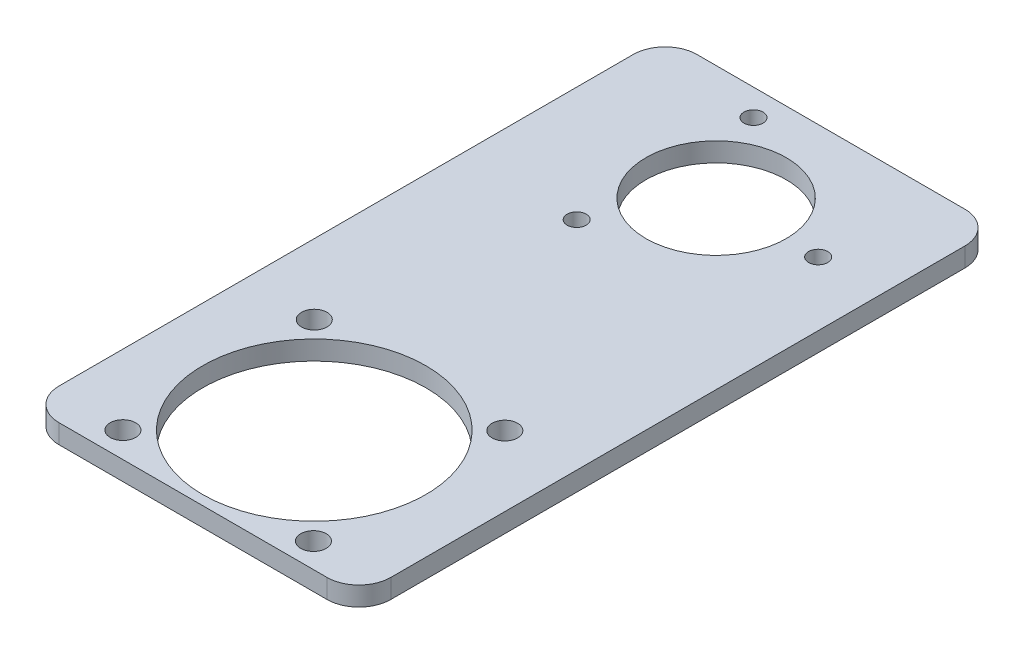
ISO-10303-21;
HEADER;
FILE_DESCRIPTION(('STEP AP214'),'2;1');
FILE_NAME('part.step','',(''),(''),'','','');
FILE_SCHEMA(('AUTOMOTIVE_DESIGN { 1 0 10303 214 1 1 1 1 }'));
ENDSEC;
DATA;
#1=APPLICATION_CONTEXT('core data for automotive mechanical design processes');
#2=APPLICATION_PROTOCOL_DEFINITION('international standard','automotive_design',2000,#1);
#3=PRODUCT_CONTEXT('',#1,'mechanical');
#4=PRODUCT('Part','Part','',(#3));
#5=PRODUCT_RELATED_PRODUCT_CATEGORY('part','',(#4));
#6=PRODUCT_DEFINITION_FORMATION('','',#4);
#7=PRODUCT_DEFINITION_CONTEXT('part definition',#1,'design');
#8=PRODUCT_DEFINITION('design','',#6,#7);
#9=PRODUCT_DEFINITION_SHAPE('','',#8);
#10=(LENGTH_UNIT() NAMED_UNIT(*) SI_UNIT(.MILLI.,.METRE.));
#11=(NAMED_UNIT(*) PLANE_ANGLE_UNIT() SI_UNIT($,.RADIAN.));
#12=(NAMED_UNIT(*) SI_UNIT($,.STERADIAN.) SOLID_ANGLE_UNIT());
#13=UNCERTAINTY_MEASURE_WITH_UNIT(LENGTH_MEASURE(1.E-05),#10,'distance_accuracy_value','');
#14=(GEOMETRIC_REPRESENTATION_CONTEXT(3) GLOBAL_UNCERTAINTY_ASSIGNED_CONTEXT((#13)) GLOBAL_UNIT_ASSIGNED_CONTEXT((#10,
#11,#12)) REPRESENTATION_CONTEXT('',''));
#15=CARTESIAN_POINT('',(0.,0.,0.));
#16=DIRECTION('',(0.,0.,1.));
#17=DIRECTION('',(1.,0.,0.));
#18=AXIS2_PLACEMENT_3D('',#15,#16,#17);
#19=CARTESIAN_POINT('',(0.,3.,-50.));
#20=DIRECTION('',(0.,0.,-1.));
#21=DIRECTION('',(-1.,0.,0.));
#22=AXIS2_PLACEMENT_3D('',#19,#20,#21);
#23=PLANE('',#22);
#24=DIRECTION('',(1.,0.,0.));
#25=VECTOR('',#24,1.);
#26=CARTESIAN_POINT('',(0.,0.,-50.));
#27=LINE('',#26,#25);
#28=CARTESIAN_POINT('',(-21.,0.,-50.));
#29=VERTEX_POINT('',#28);
#30=CARTESIAN_POINT('',(21.,0.,-50.));
#31=VERTEX_POINT('',#30);
#32=EDGE_CURVE('E150',#29,#31,#27,.T.);
#33=ORIENTED_EDGE('',*,*,#32,.F.);
#34=DIRECTION('',(0.,-1.,0.));
#35=VECTOR('',#34,1.);
#36=CARTESIAN_POINT('',(-21.,3.,-50.));
#37=LINE('',#36,#35);
#38=CARTESIAN_POINT('',(-21.,3.,-50.));
#39=VERTEX_POINT('',#38);
#40=EDGE_CURVE('E11',#39,#29,#37,.T.);
#41=ORIENTED_EDGE('',*,*,#40,.F.);
#42=DIRECTION('',(1.,0.,0.));
#43=VECTOR('',#42,1.);
#44=CARTESIAN_POINT('',(0.,3.,-50.));
#45=LINE('',#44,#43);
#46=CARTESIAN_POINT('',(21.,3.,-50.));
#47=VERTEX_POINT('',#46);
#48=EDGE_CURVE('E402',#39,#47,#45,.T.);
#49=ORIENTED_EDGE('',*,*,#48,.T.);
#50=DIRECTION('',(0.,-1.,0.));
#51=VECTOR('',#50,1.);
#52=CARTESIAN_POINT('',(21.,3.,-50.));
#53=LINE('',#52,#51);
#54=EDGE_CURVE('E85',#47,#31,#53,.T.);
#55=ORIENTED_EDGE('',*,*,#54,.T.);
#56=EDGE_LOOP('',(#33,#41,#49,#55));
#57=FACE_BOUND('',#56,.T.);
#58=ADVANCED_FACE('F34',(#57),#23,.T.);
#59=CARTESIAN_POINT('',(-21.,3.,-45.));
#60=DIRECTION('',(0.,-1.,0.));
#61=DIRECTION('',(0.,0.,-1.));
#62=AXIS2_PLACEMENT_3D('',#59,#60,#61);
#63=CYLINDRICAL_SURFACE('',#62,5.);
#64=CARTESIAN_POINT('',(-21.,0.,-45.));
#65=DIRECTION('',(0.,1.,0.));
#66=DIRECTION('',(0.,0.,1.));
#67=AXIS2_PLACEMENT_3D('',#64,#65,#66);
#68=CIRCLE('',#67,5.);
#69=CARTESIAN_POINT('',(-26.,0.,-45.));
#70=VERTEX_POINT('',#69);
#71=EDGE_CURVE('E148',#29,#70,#68,.T.);
#72=ORIENTED_EDGE('',*,*,#71,.T.);
#73=DIRECTION('',(0.,-1.,0.));
#74=VECTOR('',#73,1.);
#75=CARTESIAN_POINT('',(-26.,3.,-45.));
#76=LINE('',#75,#74);
#77=CARTESIAN_POINT('',(-26.,3.,-45.));
#78=VERTEX_POINT('',#77);
#79=EDGE_CURVE('E43',#78,#70,#76,.T.);
#80=ORIENTED_EDGE('',*,*,#79,.F.);
#81=CARTESIAN_POINT('',(-21.,3.,-45.));
#82=DIRECTION('',(0.,1.,0.));
#83=DIRECTION('',(0.,0.,1.));
#84=AXIS2_PLACEMENT_3D('',#81,#82,#83);
#85=CIRCLE('',#84,5.);
#86=EDGE_CURVE('E399',#39,#78,#85,.T.);
#87=ORIENTED_EDGE('',*,*,#86,.F.);
#88=ORIENTED_EDGE('',*,*,#40,.T.);
#89=EDGE_LOOP('',(#72,#80,#87,#88));
#90=FACE_BOUND('',#89,.T.);
#91=ADVANCED_FACE('F149',(#90),#63,.T.);
#92=CARTESIAN_POINT('',(-26.,3.,0.));
#93=DIRECTION('',(-1.,0.,0.));
#94=DIRECTION('',(0.,0.,1.));
#95=AXIS2_PLACEMENT_3D('',#92,#93,#94);
#96=PLANE('',#95);
#97=DIRECTION('',(0.,0.,-1.));
#98=VECTOR('',#97,1.);
#99=CARTESIAN_POINT('',(-26.,0.,0.));
#100=LINE('',#99,#98);
#101=CARTESIAN_POINT('',(-26.,0.,45.));
#102=VERTEX_POINT('',#101);
#103=EDGE_CURVE('E142',#102,#70,#100,.T.);
#104=ORIENTED_EDGE('',*,*,#103,.F.);
#105=DIRECTION('',(0.,-1.,0.));
#106=VECTOR('',#105,1.);
#107=CARTESIAN_POINT('',(-26.,3.,45.));
#108=LINE('',#107,#106);
#109=CARTESIAN_POINT('',(-26.,3.,45.));
#110=VERTEX_POINT('',#109);
#111=EDGE_CURVE('E134',#110,#102,#108,.T.);
#112=ORIENTED_EDGE('',*,*,#111,.F.);
#113=DIRECTION('',(0.,0.,-1.));
#114=VECTOR('',#113,1.);
#115=CARTESIAN_POINT('',(-26.,3.,0.));
#116=LINE('',#115,#114);
#117=EDGE_CURVE('E145',#110,#78,#116,.T.);
#118=ORIENTED_EDGE('',*,*,#117,.T.);
#119=ORIENTED_EDGE('',*,*,#79,.T.);
#120=EDGE_LOOP('',(#104,#112,#118,#119));
#121=FACE_BOUND('',#120,.T.);
#122=ADVANCED_FACE('F140',(#121),#96,.T.);
#123=CARTESIAN_POINT('',(-21.,3.,45.));
#124=DIRECTION('',(0.,-1.,0.));
#125=DIRECTION('',(0.,0.,-1.));
#126=AXIS2_PLACEMENT_3D('',#123,#124,#125);
#127=CYLINDRICAL_SURFACE('',#126,5.);
#128=CARTESIAN_POINT('',(-21.,0.,45.));
#129=DIRECTION('',(0.,1.,0.));
#130=DIRECTION('',(0.,0.,1.));
#131=AXIS2_PLACEMENT_3D('',#128,#129,#130);
#132=CIRCLE('',#131,5.);
#133=CARTESIAN_POINT('',(-21.,0.,50.));
#134=VERTEX_POINT('',#133);
#135=EDGE_CURVE('E155',#134,#102,#132,.F.);
#136=ORIENTED_EDGE('',*,*,#135,.F.);
#137=DIRECTION('',(0.,-1.,0.));
#138=VECTOR('',#137,1.);
#139=CARTESIAN_POINT('',(-21.,3.,50.));
#140=LINE('',#139,#138);
#141=CARTESIAN_POINT('',(-21.,3.,50.));
#142=VERTEX_POINT('',#141);
#143=EDGE_CURVE('E128',#142,#134,#140,.T.);
#144=ORIENTED_EDGE('',*,*,#143,.F.);
#145=CARTESIAN_POINT('',(-21.,3.,45.));
#146=DIRECTION('',(0.,1.,0.));
#147=DIRECTION('',(0.,0.,1.));
#148=AXIS2_PLACEMENT_3D('',#145,#146,#147);
#149=CIRCLE('',#148,5.);
#150=EDGE_CURVE('E398',#142,#110,#149,.F.);
#151=ORIENTED_EDGE('',*,*,#150,.T.);
#152=ORIENTED_EDGE('',*,*,#111,.T.);
#153=EDGE_LOOP('',(#136,#144,#151,#152));
#154=FACE_BOUND('',#153,.T.);
#155=ADVANCED_FACE('F284',(#154),#127,.T.);
#156=CARTESIAN_POINT('',(0.,3.,50.));
#157=DIRECTION('',(0.,0.,-1.));
#158=DIRECTION('',(-1.,0.,0.));
#159=AXIS2_PLACEMENT_3D('',#156,#157,#158);
#160=PLANE('',#159);
#161=DIRECTION('',(1.,0.,0.));
#162=VECTOR('',#161,1.);
#163=CARTESIAN_POINT('',(0.,0.,50.));
#164=LINE('',#163,#162);
#165=CARTESIAN_POINT('',(21.,0.,50.));
#166=VERTEX_POINT('',#165);
#167=EDGE_CURVE('E157',#134,#166,#164,.T.);
#168=ORIENTED_EDGE('',*,*,#167,.T.);
#169=DIRECTION('',(0.,-1.,0.));
#170=VECTOR('',#169,1.);
#171=CARTESIAN_POINT('',(21.,3.,50.));
#172=LINE('',#171,#170);
#173=CARTESIAN_POINT('',(21.,3.,50.));
#174=VERTEX_POINT('',#173);
#175=EDGE_CURVE('E126',#174,#166,#172,.T.);
#176=ORIENTED_EDGE('',*,*,#175,.F.);
#177=DIRECTION('',(1.,0.,0.));
#178=VECTOR('',#177,1.);
#179=CARTESIAN_POINT('',(0.,3.,50.));
#180=LINE('',#179,#178);
#181=EDGE_CURVE('E119',#142,#174,#180,.T.);
#182=ORIENTED_EDGE('',*,*,#181,.F.);
#183=ORIENTED_EDGE('',*,*,#143,.T.);
#184=EDGE_LOOP('',(#168,#176,#182,#183));
#185=FACE_BOUND('',#184,.T.);
#186=ADVANCED_FACE('F281',(#185),#160,.F.);
#187=CARTESIAN_POINT('',(21.,3.,45.));
#188=DIRECTION('',(0.,-1.,0.));
#189=DIRECTION('',(0.,0.,-1.));
#190=AXIS2_PLACEMENT_3D('',#187,#188,#189);
#191=CYLINDRICAL_SURFACE('',#190,5.);
#192=CARTESIAN_POINT('',(21.,0.,45.));
#193=DIRECTION('',(0.,1.,0.));
#194=DIRECTION('',(0.,0.,1.));
#195=AXIS2_PLACEMENT_3D('',#192,#193,#194);
#196=CIRCLE('',#195,5.);
#197=CARTESIAN_POINT('',(26.,0.,45.));
#198=VERTEX_POINT('',#197);
#199=EDGE_CURVE('E125',#166,#198,#196,.T.);
#200=ORIENTED_EDGE('',*,*,#199,.T.);
#201=DIRECTION('',(0.,-1.,0.));
#202=VECTOR('',#201,1.);
#203=CARTESIAN_POINT('',(26.,3.,45.));
#204=LINE('',#203,#202);
#205=CARTESIAN_POINT('',(26.,3.,45.));
#206=VERTEX_POINT('',#205);
#207=EDGE_CURVE('E110',#206,#198,#204,.T.);
#208=ORIENTED_EDGE('',*,*,#207,.F.);
#209=CARTESIAN_POINT('',(21.,3.,45.));
#210=DIRECTION('',(0.,1.,0.));
#211=DIRECTION('',(0.,0.,1.));
#212=AXIS2_PLACEMENT_3D('',#209,#210,#211);
#213=CIRCLE('',#212,5.);
#214=EDGE_CURVE('E113',#174,#206,#213,.T.);
#215=ORIENTED_EDGE('',*,*,#214,.F.);
#216=ORIENTED_EDGE('',*,*,#175,.T.);
#217=EDGE_LOOP('',(#200,#208,#215,#216));
#218=FACE_BOUND('',#217,.T.);
#219=ADVANCED_FACE('F124',(#218),#191,.T.);
#220=CARTESIAN_POINT('',(26.,3.,0.));
#221=DIRECTION('',(-1.,0.,0.));
#222=DIRECTION('',(0.,0.,1.));
#223=AXIS2_PLACEMENT_3D('',#220,#221,#222);
#224=PLANE('',#223);
#225=DIRECTION('',(0.,0.,-1.));
#226=VECTOR('',#225,1.);
#227=CARTESIAN_POINT('',(26.,0.,0.));
#228=LINE('',#227,#226);
#229=CARTESIAN_POINT('',(26.,0.,-45.));
#230=VERTEX_POINT('',#229);
#231=EDGE_CURVE('E164',#198,#230,#228,.T.);
#232=ORIENTED_EDGE('',*,*,#231,.T.);
#233=DIRECTION('',(0.,-1.,0.));
#234=VECTOR('',#233,1.);
#235=CARTESIAN_POINT('',(26.,3.,-45.));
#236=LINE('',#235,#234);
#237=CARTESIAN_POINT('',(26.,3.,-45.));
#238=VERTEX_POINT('',#237);
#239=EDGE_CURVE('E112',#238,#230,#236,.T.);
#240=ORIENTED_EDGE('',*,*,#239,.F.);
#241=DIRECTION('',(0.,0.,-1.));
#242=VECTOR('',#241,1.);
#243=CARTESIAN_POINT('',(26.,3.,0.));
#244=LINE('',#243,#242);
#245=EDGE_CURVE('E105',#206,#238,#244,.T.);
#246=ORIENTED_EDGE('',*,*,#245,.F.);
#247=ORIENTED_EDGE('',*,*,#207,.T.);
#248=EDGE_LOOP('',(#232,#240,#246,#247));
#249=FACE_BOUND('',#248,.T.);
#250=ADVANCED_FACE('F108',(#249),#224,.F.);
#251=CARTESIAN_POINT('',(-15.,3.,46.));
#252=DIRECTION('',(0.,-1.,0.));
#253=DIRECTION('',(0.,0.,-1.));
#254=AXIS2_PLACEMENT_3D('',#251,#252,#253);
#255=CYLINDRICAL_SURFACE('',#254,2.);
#256=CARTESIAN_POINT('',(-15.,3.,46.));
#257=DIRECTION('',(0.,1.,0.));
#258=DIRECTION('',(0.,0.,1.));
#259=AXIS2_PLACEMENT_3D('',#256,#257,#258);
#260=CIRCLE('',#259,2.);
#261=CARTESIAN_POINT('',(-15.,3.,48.));
#262=VERTEX_POINT('',#261);
#263=EDGE_CURVE('E407',#262,#262,#260,.T.);
#264=ORIENTED_EDGE('',*,*,#263,.T.);
#265=EDGE_LOOP('',(#264));
#266=FACE_BOUND('',#265,.T.);
#267=CARTESIAN_POINT('',(-15.,0.,46.));
#268=DIRECTION('',(0.,1.,0.));
#269=DIRECTION('',(0.,0.,1.));
#270=AXIS2_PLACEMENT_3D('',#267,#268,#269);
#271=CIRCLE('',#270,2.);
#272=CARTESIAN_POINT('',(-15.,0.,48.));
#273=VERTEX_POINT('',#272);
#274=EDGE_CURVE('E193',#273,#273,#271,.T.);
#275=ORIENTED_EDGE('',*,*,#274,.F.);
#276=EDGE_LOOP('',(#275));
#277=FACE_BOUND('',#276,.T.);
#278=ADVANCED_FACE('F203',(#266,#277),#255,.F.);
#279=CARTESIAN_POINT('',(14.9997387274878,3.,46.1252049618425));
#280=DIRECTION('',(0.,-1.,0.));
#281=DIRECTION('',(0.,0.,-1.));
#282=AXIS2_PLACEMENT_3D('',#279,#280,#281);
#283=CYLINDRICAL_SURFACE('',#282,2.00000000000001);
#284=CARTESIAN_POINT('',(14.9997387274878,3.,46.1252049618425));
#285=DIRECTION('',(0.,1.,0.));
#286=DIRECTION('',(0.,0.,1.));
#287=AXIS2_PLACEMENT_3D('',#284,#285,#286);
#288=CIRCLE('',#287,2.00000000000001);
#289=CARTESIAN_POINT('',(14.9997387274878,3.,48.1252049618425));
#290=VERTEX_POINT('',#289);
#291=EDGE_CURVE('E410',#290,#290,#288,.T.);
#292=ORIENTED_EDGE('',*,*,#291,.T.);
#293=EDGE_LOOP('',(#292));
#294=FACE_BOUND('',#293,.T.);
#295=CARTESIAN_POINT('',(14.9997387274878,0.,46.1252049618425));
#296=DIRECTION('',(0.,1.,0.));
#297=DIRECTION('',(0.,0.,1.));
#298=AXIS2_PLACEMENT_3D('',#295,#296,#297);
#299=CIRCLE('',#298,2.00000000000001);
#300=CARTESIAN_POINT('',(14.9997387274878,0.,48.1252049618425));
#301=VERTEX_POINT('',#300);
#302=EDGE_CURVE('E190',#301,#301,#299,.T.);
#303=ORIENTED_EDGE('',*,*,#302,.F.);
#304=EDGE_LOOP('',(#303));
#305=FACE_BOUND('',#304,.T.);
#306=ADVANCED_FACE('F206',(#294,#305),#283,.F.);
#307=CARTESIAN_POINT('',(14.9997387274878,3.,16.1252049618425));
#308=DIRECTION('',(0.,-1.,0.));
#309=DIRECTION('',(0.,0.,-1.));
#310=AXIS2_PLACEMENT_3D('',#307,#308,#309);
#311=CYLINDRICAL_SURFACE('',#310,2.00000000000001);
#312=CARTESIAN_POINT('',(14.9997387274878,3.,16.1252049618425));
#313=DIRECTION('',(0.,1.,0.));
#314=DIRECTION('',(0.,0.,1.));
#315=AXIS2_PLACEMENT_3D('',#312,#313,#314);
#316=CIRCLE('',#315,2.00000000000001);
#317=CARTESIAN_POINT('',(14.9997387274878,3.,18.1252049618425));
#318=VERTEX_POINT('',#317);
#319=EDGE_CURVE('E413',#318,#318,#316,.T.);
#320=ORIENTED_EDGE('',*,*,#319,.T.);
#321=EDGE_LOOP('',(#320));
#322=FACE_BOUND('',#321,.T.);
#323=CARTESIAN_POINT('',(14.9997387274878,0.,16.1252049618425));
#324=DIRECTION('',(0.,1.,0.));
#325=DIRECTION('',(0.,0.,1.));
#326=AXIS2_PLACEMENT_3D('',#323,#324,#325);
#327=CIRCLE('',#326,2.00000000000001);
#328=CARTESIAN_POINT('',(14.9997387274878,0.,18.1252049618425));
#329=VERTEX_POINT('',#328);
#330=EDGE_CURVE('E187',#329,#329,#327,.T.);
#331=ORIENTED_EDGE('',*,*,#330,.F.);
#332=EDGE_LOOP('',(#331));
#333=FACE_BOUND('',#332,.T.);
#334=ADVANCED_FACE('F210',(#322,#333),#311,.F.);
#335=CARTESIAN_POINT('',(-15.,3.,16.));
#336=DIRECTION('',(0.,-1.,0.));
#337=DIRECTION('',(0.,0.,-1.));
#338=AXIS2_PLACEMENT_3D('',#335,#336,#337);
#339=CYLINDRICAL_SURFACE('',#338,2.);
#340=CARTESIAN_POINT('',(-15.,3.,16.));
#341=DIRECTION('',(0.,1.,0.));
#342=DIRECTION('',(0.,0.,1.));
#343=AXIS2_PLACEMENT_3D('',#340,#341,#342);
#344=CIRCLE('',#343,2.);
#345=CARTESIAN_POINT('',(-15.,3.,18.));
#346=VERTEX_POINT('',#345);
#347=EDGE_CURVE('E416',#346,#346,#344,.T.);
#348=ORIENTED_EDGE('',*,*,#347,.T.);
#349=EDGE_LOOP('',(#348));
#350=FACE_BOUND('',#349,.T.);
#351=CARTESIAN_POINT('',(-15.,0.,16.));
#352=DIRECTION('',(0.,1.,0.));
#353=DIRECTION('',(0.,0.,1.));
#354=AXIS2_PLACEMENT_3D('',#351,#352,#353);
#355=CIRCLE('',#354,2.);
#356=CARTESIAN_POINT('',(-15.,0.,18.));
#357=VERTEX_POINT('',#356);
#358=EDGE_CURVE('E184',#357,#357,#355,.T.);
#359=ORIENTED_EDGE('',*,*,#358,.F.);
#360=EDGE_LOOP('',(#359));
#361=FACE_BOUND('',#360,.T.);
#362=ADVANCED_FACE('F214',(#350,#361),#339,.F.);
#363=CARTESIAN_POINT('',(0.,3.,31.));
#364=DIRECTION('',(0.,-1.,0.));
#365=DIRECTION('',(0.,0.,-1.));
#366=AXIS2_PLACEMENT_3D('',#363,#364,#365);
#367=CYLINDRICAL_SURFACE('',#366,17.5);
#368=CARTESIAN_POINT('',(0.,3.,31.));
#369=DIRECTION('',(0.,1.,0.));
#370=DIRECTION('',(0.,0.,1.));
#371=AXIS2_PLACEMENT_3D('',#368,#369,#370);
#372=CIRCLE('',#371,17.5);
#373=CARTESIAN_POINT('',(0.,3.,48.5));
#374=VERTEX_POINT('',#373);
#375=EDGE_CURVE('E419',#374,#374,#372,.T.);
#376=ORIENTED_EDGE('',*,*,#375,.T.);
#377=EDGE_LOOP('',(#376));
#378=FACE_BOUND('',#377,.T.);
#379=CARTESIAN_POINT('',(0.,0.,31.));
#380=DIRECTION('',(0.,1.,0.));
#381=DIRECTION('',(0.,0.,1.));
#382=AXIS2_PLACEMENT_3D('',#379,#380,#381);
#383=CIRCLE('',#382,17.5);
#384=CARTESIAN_POINT('',(0.,0.,48.5));
#385=VERTEX_POINT('',#384);
#386=EDGE_CURVE('E181',#385,#385,#383,.T.);
#387=ORIENTED_EDGE('',*,*,#386,.F.);
#388=EDGE_LOOP('',(#387));
#389=FACE_BOUND('',#388,.T.);
#390=ADVANCED_FACE('F218',(#378,#389),#367,.F.);
#391=CARTESIAN_POINT('',(-7.99999999999998,3.,-45.856406460551));
#392=DIRECTION('',(0.,-1.,0.));
#393=DIRECTION('',(0.,0.,-1.));
#394=AXIS2_PLACEMENT_3D('',#391,#392,#393);
#395=CYLINDRICAL_SURFACE('',#394,1.5);
#396=CARTESIAN_POINT('',(-7.99999999999998,3.,-45.856406460551));
#397=DIRECTION('',(0.,1.,0.));
#398=DIRECTION('',(0.,0.,1.));
#399=AXIS2_PLACEMENT_3D('',#396,#397,#398);
#400=CIRCLE('',#399,1.5);
#401=CARTESIAN_POINT('',(-7.99999999999998,3.,-44.356406460551));
#402=VERTEX_POINT('',#401);
#403=EDGE_CURVE('E422',#402,#402,#400,.T.);
#404=ORIENTED_EDGE('',*,*,#403,.T.);
#405=EDGE_LOOP('',(#404));
#406=FACE_BOUND('',#405,.T.);
#407=CARTESIAN_POINT('',(-7.99999999999998,0.,-45.856406460551));
#408=DIRECTION('',(0.,1.,0.));
#409=DIRECTION('',(0.,0.,1.));
#410=AXIS2_PLACEMENT_3D('',#407,#408,#409);
#411=CIRCLE('',#410,1.5);
#412=CARTESIAN_POINT('',(-7.99999999999998,0.,-44.356406460551));
#413=VERTEX_POINT('',#412);
#414=EDGE_CURVE('E178',#413,#413,#411,.T.);
#415=ORIENTED_EDGE('',*,*,#414,.F.);
#416=EDGE_LOOP('',(#415));
#417=FACE_BOUND('',#416,.T.);
#418=ADVANCED_FACE('F222',(#406,#417),#395,.F.);
#419=CARTESIAN_POINT('',(16.,3.,-32.));
#420=DIRECTION('',(0.,-1.,0.));
#421=DIRECTION('',(0.,0.,-1.));
#422=AXIS2_PLACEMENT_3D('',#419,#420,#421);
#423=CYLINDRICAL_SURFACE('',#422,1.5);
#424=CARTESIAN_POINT('',(16.,3.,-32.));
#425=DIRECTION('',(0.,1.,0.));
#426=DIRECTION('',(0.,0.,1.));
#427=AXIS2_PLACEMENT_3D('',#424,#425,#426);
#428=CIRCLE('',#427,1.5);
#429=CARTESIAN_POINT('',(16.,3.,-30.5));
#430=VERTEX_POINT('',#429);
#431=EDGE_CURVE('E425',#430,#430,#428,.T.);
#432=ORIENTED_EDGE('',*,*,#431,.T.);
#433=EDGE_LOOP('',(#432));
#434=FACE_BOUND('',#433,.T.);
#435=CARTESIAN_POINT('',(16.,0.,-32.));
#436=DIRECTION('',(0.,1.,0.));
#437=DIRECTION('',(0.,0.,1.));
#438=AXIS2_PLACEMENT_3D('',#435,#436,#437);
#439=CIRCLE('',#438,1.5);
#440=CARTESIAN_POINT('',(16.,0.,-30.5));
#441=VERTEX_POINT('',#440);
#442=EDGE_CURVE('E175',#441,#441,#439,.T.);
#443=ORIENTED_EDGE('',*,*,#442,.F.);
#444=EDGE_LOOP('',(#443));
#445=FACE_BOUND('',#444,.T.);
#446=ADVANCED_FACE('F226',(#434,#445),#423,.F.);
#447=CARTESIAN_POINT('',(0.,3.,-32.));
#448=DIRECTION('',(0.,-1.,0.));
#449=DIRECTION('',(0.,0.,-1.));
#450=AXIS2_PLACEMENT_3D('',#447,#448,#449);
#451=CYLINDRICAL_SURFACE('',#450,11.);
#452=CARTESIAN_POINT('',(0.,3.,-32.));
#453=DIRECTION('',(0.,1.,0.));
#454=DIRECTION('',(0.,0.,1.));
#455=AXIS2_PLACEMENT_3D('',#452,#453,#454);
#456=CIRCLE('',#455,11.);
#457=CARTESIAN_POINT('',(0.,3.,-21.));
#458=VERTEX_POINT('',#457);
#459=EDGE_CURVE('E241',#458,#458,#456,.T.);
#460=ORIENTED_EDGE('',*,*,#459,.T.);
#461=EDGE_LOOP('',(#460));
#462=FACE_BOUND('',#461,.T.);
#463=CARTESIAN_POINT('',(0.,0.,-32.));
#464=DIRECTION('',(0.,1.,0.));
#465=DIRECTION('',(0.,0.,1.));
#466=AXIS2_PLACEMENT_3D('',#463,#464,#465);
#467=CIRCLE('',#466,11.);
#468=CARTESIAN_POINT('',(0.,0.,-21.));
#469=VERTEX_POINT('',#468);
#470=EDGE_CURVE('E172',#469,#469,#467,.T.);
#471=ORIENTED_EDGE('',*,*,#470,.F.);
#472=EDGE_LOOP('',(#471));
#473=FACE_BOUND('',#472,.T.);
#474=ADVANCED_FACE('F229',(#462,#473),#451,.F.);
#475=CARTESIAN_POINT('',(-8.00000000000007,3.,-18.143593539449));
#476=DIRECTION('',(0.,-1.,0.));
#477=DIRECTION('',(0.,0.,-1.));
#478=AXIS2_PLACEMENT_3D('',#475,#476,#477);
#479=CYLINDRICAL_SURFACE('',#478,1.5);
#480=CARTESIAN_POINT('',(-8.00000000000007,3.,-18.143593539449));
#481=DIRECTION('',(0.,1.,0.));
#482=DIRECTION('',(0.,0.,1.));
#483=AXIS2_PLACEMENT_3D('',#480,#481,#482);
#484=CIRCLE('',#483,1.5);
#485=CARTESIAN_POINT('',(-8.00000000000007,3.,-16.643593539449));
#486=VERTEX_POINT('',#485);
#487=EDGE_CURVE('E166',#486,#486,#484,.T.);
#488=ORIENTED_EDGE('',*,*,#487,.T.);
#489=EDGE_LOOP('',(#488));
#490=FACE_BOUND('',#489,.T.);
#491=CARTESIAN_POINT('',(-8.00000000000007,0.,-18.143593539449));
#492=DIRECTION('',(0.,1.,0.));
#493=DIRECTION('',(0.,0.,1.));
#494=AXIS2_PLACEMENT_3D('',#491,#492,#493);
#495=CIRCLE('',#494,1.5);
#496=CARTESIAN_POINT('',(-8.00000000000007,0.,-16.643593539449));
#497=VERTEX_POINT('',#496);
#498=EDGE_CURVE('E169',#497,#497,#495,.T.);
#499=ORIENTED_EDGE('',*,*,#498,.F.);
#500=EDGE_LOOP('',(#499));
#501=FACE_BOUND('',#500,.T.);
#502=ADVANCED_FACE('F36',(#490,#501),#479,.F.);
#503=CARTESIAN_POINT('',(21.,3.,-45.));
#504=DIRECTION('',(0.,-1.,0.));
#505=DIRECTION('',(0.,0.,-1.));
#506=AXIS2_PLACEMENT_3D('',#503,#504,#505);
#507=CYLINDRICAL_SURFACE('',#506,5.);
#508=CARTESIAN_POINT('',(21.,0.,-45.));
#509=DIRECTION('',(0.,1.,0.));
#510=DIRECTION('',(0.,0.,1.));
#511=AXIS2_PLACEMENT_3D('',#508,#509,#510);
#512=CIRCLE('',#511,5.);
#513=EDGE_CURVE('E78',#230,#31,#512,.T.);
#514=ORIENTED_EDGE('',*,*,#513,.T.);
#515=ORIENTED_EDGE('',*,*,#54,.F.);
#516=CARTESIAN_POINT('',(21.,3.,-45.));
#517=DIRECTION('',(0.,1.,0.));
#518=DIRECTION('',(0.,0.,1.));
#519=AXIS2_PLACEMENT_3D('',#516,#517,#518);
#520=CIRCLE('',#519,5.);
#521=EDGE_CURVE('E51',#238,#47,#520,.T.);
#522=ORIENTED_EDGE('',*,*,#521,.F.);
#523=ORIENTED_EDGE('',*,*,#239,.T.);
#524=EDGE_LOOP('',(#514,#515,#522,#523));
#525=FACE_BOUND('',#524,.T.);
#526=ADVANCED_FACE('F236',(#525),#507,.T.);
#527=CARTESIAN_POINT('',(0.,3.,0.));
#528=DIRECTION('',(0.,1.,0.));
#529=DIRECTION('',(0.,0.,1.));
#530=AXIS2_PLACEMENT_3D('',#527,#528,#529);
#531=PLANE('',#530);
#532=ORIENTED_EDGE('',*,*,#487,.F.);
#533=EDGE_LOOP('',(#532));
#534=FACE_BOUND('',#533,.T.);
#535=ORIENTED_EDGE('',*,*,#459,.F.);
#536=EDGE_LOOP('',(#535));
#537=FACE_BOUND('',#536,.T.);
#538=ORIENTED_EDGE('',*,*,#431,.F.);
#539=EDGE_LOOP('',(#538));
#540=FACE_BOUND('',#539,.T.);
#541=ORIENTED_EDGE('',*,*,#403,.F.);
#542=EDGE_LOOP('',(#541));
#543=FACE_BOUND('',#542,.T.);
#544=ORIENTED_EDGE('',*,*,#375,.F.);
#545=EDGE_LOOP('',(#544));
#546=FACE_BOUND('',#545,.T.);
#547=ORIENTED_EDGE('',*,*,#347,.F.);
#548=EDGE_LOOP('',(#547));
#549=FACE_BOUND('',#548,.T.);
#550=ORIENTED_EDGE('',*,*,#319,.F.);
#551=EDGE_LOOP('',(#550));
#552=FACE_BOUND('',#551,.T.);
#553=ORIENTED_EDGE('',*,*,#291,.F.);
#554=EDGE_LOOP('',(#553));
#555=FACE_BOUND('',#554,.T.);
#556=ORIENTED_EDGE('',*,*,#263,.F.);
#557=EDGE_LOOP('',(#556));
#558=FACE_BOUND('',#557,.T.);
#559=ORIENTED_EDGE('',*,*,#48,.F.);
#560=ORIENTED_EDGE('',*,*,#86,.T.);
#561=ORIENTED_EDGE('',*,*,#117,.F.);
#562=ORIENTED_EDGE('',*,*,#150,.F.);
#563=ORIENTED_EDGE('',*,*,#181,.T.);
#564=ORIENTED_EDGE('',*,*,#214,.T.);
#565=ORIENTED_EDGE('',*,*,#245,.T.);
#566=ORIENTED_EDGE('',*,*,#521,.T.);
#567=EDGE_LOOP('',(#559,#560,#561,#562,#563,#564,#565,#566));
#568=FACE_BOUND('',#567,.T.);
#569=ADVANCED_FACE('F116',(#534,#537,#540,#543,#546,#549,#552,#555,#558,#568),#531,.T.);
#570=CARTESIAN_POINT('',(0.,0.,0.));
#571=DIRECTION('',(0.,1.,0.));
#572=DIRECTION('',(0.,0.,1.));
#573=AXIS2_PLACEMENT_3D('',#570,#571,#572);
#574=PLANE('',#573);
#575=ORIENTED_EDGE('',*,*,#498,.T.);
#576=EDGE_LOOP('',(#575));
#577=FACE_BOUND('',#576,.T.);
#578=ORIENTED_EDGE('',*,*,#470,.T.);
#579=EDGE_LOOP('',(#578));
#580=FACE_BOUND('',#579,.T.);
#581=ORIENTED_EDGE('',*,*,#442,.T.);
#582=EDGE_LOOP('',(#581));
#583=FACE_BOUND('',#582,.T.);
#584=ORIENTED_EDGE('',*,*,#414,.T.);
#585=EDGE_LOOP('',(#584));
#586=FACE_BOUND('',#585,.T.);
#587=ORIENTED_EDGE('',*,*,#386,.T.);
#588=EDGE_LOOP('',(#587));
#589=FACE_BOUND('',#588,.T.);
#590=ORIENTED_EDGE('',*,*,#358,.T.);
#591=EDGE_LOOP('',(#590));
#592=FACE_BOUND('',#591,.T.);
#593=ORIENTED_EDGE('',*,*,#330,.T.);
#594=EDGE_LOOP('',(#593));
#595=FACE_BOUND('',#594,.T.);
#596=ORIENTED_EDGE('',*,*,#302,.T.);
#597=EDGE_LOOP('',(#596));
#598=FACE_BOUND('',#597,.T.);
#599=ORIENTED_EDGE('',*,*,#274,.T.);
#600=EDGE_LOOP('',(#599));
#601=FACE_BOUND('',#600,.T.);
#602=ORIENTED_EDGE('',*,*,#32,.T.);
#603=ORIENTED_EDGE('',*,*,#513,.F.);
#604=ORIENTED_EDGE('',*,*,#231,.F.);
#605=ORIENTED_EDGE('',*,*,#199,.F.);
#606=ORIENTED_EDGE('',*,*,#167,.F.);
#607=ORIENTED_EDGE('',*,*,#135,.T.);
#608=ORIENTED_EDGE('',*,*,#103,.T.);
#609=ORIENTED_EDGE('',*,*,#71,.F.);
#610=EDGE_LOOP('',(#602,#603,#604,#605,#606,#607,#608,#609));
#611=FACE_BOUND('',#610,.T.);
#612=ADVANCED_FACE('F152',(#577,#580,#583,#586,#589,#592,#595,#598,#601,#611),#574,.F.);
#613=CLOSED_SHELL('',(#58,#91,#122,#155,#186,#219,#250,#278,#306,#334,#362,#390,#418,#446,#474,
#502,#526,#569,#612));
#614=MANIFOLD_SOLID_BREP('B2',#613);
#615=ADVANCED_BREP_SHAPE_REPRESENTATION('',(#18,#614),#14);
#616=SHAPE_DEFINITION_REPRESENTATION(#9,#615);
ENDSEC;
END-ISO-10303-21;
